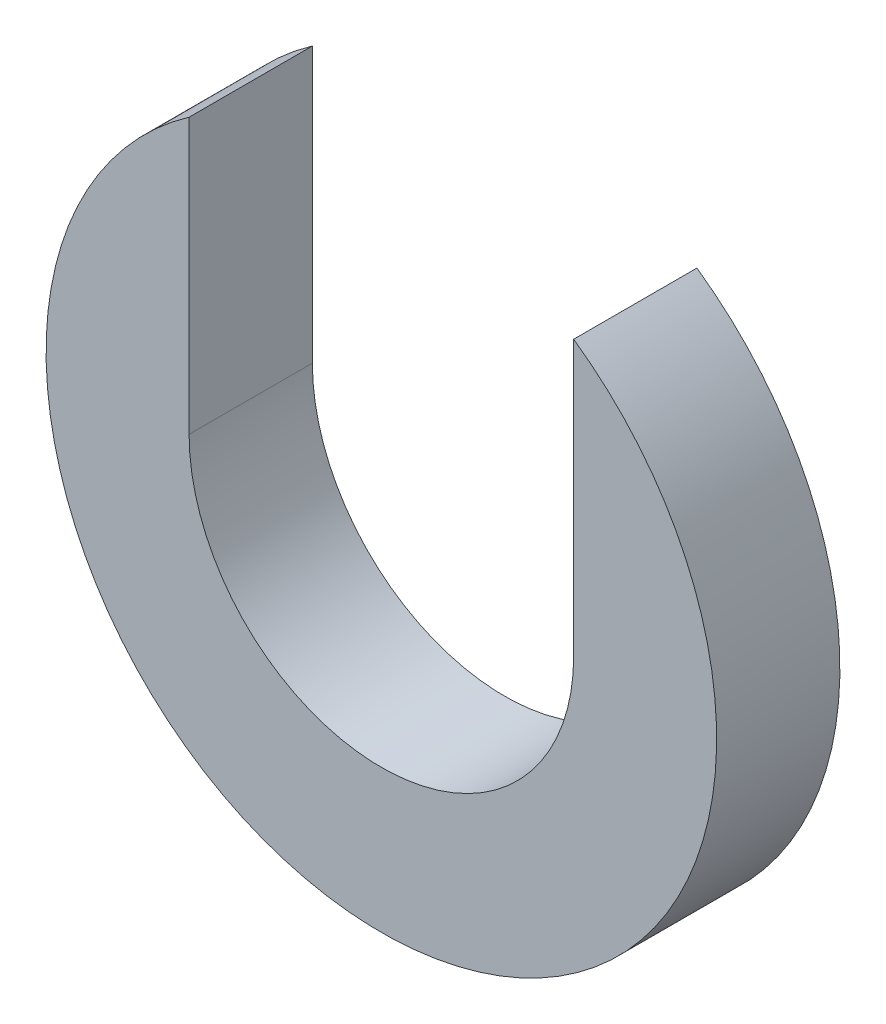
ISO-10303-21;
HEADER;
FILE_DESCRIPTION(('STEP AP214'),'2;1');
FILE_NAME('part.step','',(''),(''),'','','');
FILE_SCHEMA(('AUTOMOTIVE_DESIGN { 1 0 10303 214 1 1 1 1 }'));
ENDSEC;
DATA;
#1=APPLICATION_CONTEXT('core data for automotive mechanical design processes');
#2=APPLICATION_PROTOCOL_DEFINITION('international standard','automotive_design',2000,#1);
#3=PRODUCT_CONTEXT('',#1,'mechanical');
#4=PRODUCT('Part','Part','',(#3));
#5=PRODUCT_RELATED_PRODUCT_CATEGORY('part','',(#4));
#6=PRODUCT_DEFINITION_FORMATION('','',#4);
#7=PRODUCT_DEFINITION_CONTEXT('part definition',#1,'design');
#8=PRODUCT_DEFINITION('design','',#6,#7);
#9=PRODUCT_DEFINITION_SHAPE('','',#8);
#10=(LENGTH_UNIT() NAMED_UNIT(*) SI_UNIT(.MILLI.,.METRE.));
#11=(NAMED_UNIT(*) PLANE_ANGLE_UNIT() SI_UNIT($,.RADIAN.));
#12=(NAMED_UNIT(*) SI_UNIT($,.STERADIAN.) SOLID_ANGLE_UNIT());
#13=UNCERTAINTY_MEASURE_WITH_UNIT(LENGTH_MEASURE(1.E-05),#10,'distance_accuracy_value','');
#14=(GEOMETRIC_REPRESENTATION_CONTEXT(3) GLOBAL_UNCERTAINTY_ASSIGNED_CONTEXT((#13)) GLOBAL_UNIT_ASSIGNED_CONTEXT((#10,
#11,#12)) REPRESENTATION_CONTEXT('',''));
#15=CARTESIAN_POINT('',(0.,0.,0.));
#16=DIRECTION('',(0.,0.,1.));
#17=DIRECTION('',(1.,0.,0.));
#18=AXIS2_PLACEMENT_3D('',#15,#16,#17);
#19=CARTESIAN_POINT('',(0.,0.,3.175));
#20=DIRECTION('',(0.,0.,-1.));
#21=DIRECTION('',(-1.,0.,0.));
#22=AXIS2_PLACEMENT_3D('',#19,#20,#21);
#23=CYLINDRICAL_SURFACE('',#22,4.953);
#24=CARTESIAN_POINT('',(0.,0.,0.));
#25=DIRECTION('',(0.,0.,-1.));
#26=DIRECTION('',(1.,0.,0.));
#27=AXIS2_PLACEMENT_3D('',#24,#25,#26);
#28=CIRCLE('',#27,4.953);
#29=CARTESIAN_POINT('',(4.953,0.,0.));
#30=VERTEX_POINT('',#29);
#31=CARTESIAN_POINT('',(-4.953,0.,0.));
#32=VERTEX_POINT('',#31);
#33=EDGE_CURVE('E102',#30,#32,#28,.T.);
#34=ORIENTED_EDGE('',*,*,#33,.T.);
#35=DIRECTION('',(0.,0.,-1.));
#36=VECTOR('',#35,1.);
#37=CARTESIAN_POINT('',(-4.953,0.,3.175));
#38=LINE('',#37,#36);
#39=CARTESIAN_POINT('',(-4.953,0.,3.175));
#40=VERTEX_POINT('',#39);
#41=EDGE_CURVE('E11',#40,#32,#38,.T.);
#42=ORIENTED_EDGE('',*,*,#41,.F.);
#43=CARTESIAN_POINT('',(0.,0.,3.175));
#44=DIRECTION('',(0.,0.,-1.));
#45=DIRECTION('',(1.,0.,0.));
#46=AXIS2_PLACEMENT_3D('',#43,#44,#45);
#47=CIRCLE('',#46,4.953);
#48=CARTESIAN_POINT('',(4.953,0.,3.175));
#49=VERTEX_POINT('',#48);
#50=EDGE_CURVE('E90',#49,#40,#47,.T.);
#51=ORIENTED_EDGE('',*,*,#50,.F.);
#52=DIRECTION('',(0.,0.,-1.));
#53=VECTOR('',#52,1.);
#54=CARTESIAN_POINT('',(4.953,0.,3.175));
#55=LINE('',#54,#53);
#56=EDGE_CURVE('E98',#49,#30,#55,.T.);
#57=ORIENTED_EDGE('',*,*,#56,.T.);
#58=EDGE_LOOP('',(#34,#42,#51,#57));
#59=FACE_BOUND('',#58,.T.);
#60=ADVANCED_FACE('F39',(#59),#23,.F.);
#61=CARTESIAN_POINT('',(-4.953,0.,3.175));
#62=DIRECTION('',(-1.,0.,0.));
#63=DIRECTION('',(0.,0.,1.));
#64=AXIS2_PLACEMENT_3D('',#61,#62,#63);
#65=PLANE('',#64);
#66=DIRECTION('',(0.,1.,0.));
#67=VECTOR('',#66,1.);
#68=CARTESIAN_POINT('',(-4.953,0.,0.));
#69=LINE('',#68,#67);
#70=CARTESIAN_POINT('',(-4.953,7.07448139442037,0.));
#71=VERTEX_POINT('',#70);
#72=EDGE_CURVE('E94',#32,#71,#69,.T.);
#73=ORIENTED_EDGE('',*,*,#72,.T.);
#74=DIRECTION('',(0.,0.,-1.));
#75=VECTOR('',#74,1.);
#76=CARTESIAN_POINT('',(-4.953,7.07448139442037,3.175));
#77=LINE('',#76,#75);
#78=CARTESIAN_POINT('',(-4.953,7.07448139442037,3.175));
#79=VERTEX_POINT('',#78);
#80=EDGE_CURVE('E47',#79,#71,#77,.T.);
#81=ORIENTED_EDGE('',*,*,#80,.F.);
#82=DIRECTION('',(0.,1.,0.));
#83=VECTOR('',#82,1.);
#84=CARTESIAN_POINT('',(-4.953,0.,3.175));
#85=LINE('',#84,#83);
#86=EDGE_CURVE('E85',#40,#79,#85,.T.);
#87=ORIENTED_EDGE('',*,*,#86,.F.);
#88=ORIENTED_EDGE('',*,*,#41,.T.);
#89=EDGE_LOOP('',(#73,#81,#87,#88));
#90=FACE_BOUND('',#89,.T.);
#91=ADVANCED_FACE('F93',(#90),#65,.F.);
#92=CARTESIAN_POINT('',(0.,0.,3.175));
#93=DIRECTION('',(0.,0.,-1.));
#94=DIRECTION('',(-1.,0.,0.));
#95=AXIS2_PLACEMENT_3D('',#92,#93,#94);
#96=CYLINDRICAL_SURFACE('',#95,8.636);
#97=CARTESIAN_POINT('',(0.,0.,0.));
#98=DIRECTION('',(0.,0.,1.));
#99=DIRECTION('',(1.,0.,0.));
#100=AXIS2_PLACEMENT_3D('',#97,#98,#99);
#101=CIRCLE('',#100,8.636);
#102=CARTESIAN_POINT('',(4.953,7.07448139442037,0.));
#103=VERTEX_POINT('',#102);
#104=EDGE_CURVE('E72',#71,#103,#101,.T.);
#105=ORIENTED_EDGE('',*,*,#104,.T.);
#106=DIRECTION('',(0.,0.,-1.));
#107=VECTOR('',#106,1.);
#108=CARTESIAN_POINT('',(4.953,7.07448139442037,3.175));
#109=LINE('',#108,#107);
#110=CARTESIAN_POINT('',(4.953,7.07448139442037,3.175));
#111=VERTEX_POINT('',#110);
#112=EDGE_CURVE('E95',#111,#103,#109,.T.);
#113=ORIENTED_EDGE('',*,*,#112,.F.);
#114=CARTESIAN_POINT('',(0.,0.,3.175));
#115=DIRECTION('',(0.,0.,1.));
#116=DIRECTION('',(1.,0.,0.));
#117=AXIS2_PLACEMENT_3D('',#114,#115,#116);
#118=CIRCLE('',#117,8.636);
#119=EDGE_CURVE('E88',#79,#111,#118,.T.);
#120=ORIENTED_EDGE('',*,*,#119,.F.);
#121=ORIENTED_EDGE('',*,*,#80,.T.);
#122=EDGE_LOOP('',(#105,#113,#120,#121));
#123=FACE_BOUND('',#122,.T.);
#124=ADVANCED_FACE('F96',(#123),#96,.T.);
#125=CARTESIAN_POINT('',(4.953,0.,3.175));
#126=DIRECTION('',(1.,0.,0.));
#127=DIRECTION('',(0.,0.,-1.));
#128=AXIS2_PLACEMENT_3D('',#125,#126,#127);
#129=PLANE('',#128);
#130=DIRECTION('',(0.,-1.,0.));
#131=VECTOR('',#130,1.);
#132=CARTESIAN_POINT('',(4.953,0.,0.));
#133=LINE('',#132,#131);
#134=EDGE_CURVE('E78',#103,#30,#133,.T.);
#135=ORIENTED_EDGE('',*,*,#134,.T.);
#136=ORIENTED_EDGE('',*,*,#56,.F.);
#137=DIRECTION('',(0.,-1.,0.));
#138=VECTOR('',#137,1.);
#139=CARTESIAN_POINT('',(4.953,0.,3.175));
#140=LINE('',#139,#138);
#141=EDGE_CURVE('E55',#111,#49,#140,.T.);
#142=ORIENTED_EDGE('',*,*,#141,.F.);
#143=ORIENTED_EDGE('',*,*,#112,.T.);
#144=EDGE_LOOP('',(#135,#136,#142,#143));
#145=FACE_BOUND('',#144,.T.);
#146=ADVANCED_FACE('F109',(#145),#129,.F.);
#147=CARTESIAN_POINT('',(0.,0.,3.175));
#148=DIRECTION('',(0.,0.,1.));
#149=DIRECTION('',(1.,0.,0.));
#150=AXIS2_PLACEMENT_3D('',#147,#148,#149);
#151=PLANE('',#150);
#152=ORIENTED_EDGE('',*,*,#50,.T.);
#153=ORIENTED_EDGE('',*,*,#86,.T.);
#154=ORIENTED_EDGE('',*,*,#119,.T.);
#155=ORIENTED_EDGE('',*,*,#141,.T.);
#156=EDGE_LOOP('',(#152,#153,#154,#155));
#157=FACE_BOUND('',#156,.T.);
#158=ADVANCED_FACE('F86',(#157),#151,.T.);
#159=CARTESIAN_POINT('',(0.,0.,0.));
#160=DIRECTION('',(0.,0.,1.));
#161=DIRECTION('',(1.,0.,0.));
#162=AXIS2_PLACEMENT_3D('',#159,#160,#161);
#163=PLANE('',#162);
#164=ORIENTED_EDGE('',*,*,#33,.F.);
#165=ORIENTED_EDGE('',*,*,#134,.F.);
#166=ORIENTED_EDGE('',*,*,#104,.F.);
#167=ORIENTED_EDGE('',*,*,#72,.F.);
#168=EDGE_LOOP('',(#164,#165,#166,#167));
#169=FACE_BOUND('',#168,.T.);
#170=ADVANCED_FACE('F112',(#169),#163,.F.);
#171=CLOSED_SHELL('',(#60,#91,#124,#146,#158,#170));
#172=MANIFOLD_SOLID_BREP('B2',#171);
#173=ADVANCED_BREP_SHAPE_REPRESENTATION('',(#18,#172),#14);
#174=SHAPE_DEFINITION_REPRESENTATION(#9,#173);
ENDSEC;
END-ISO-10303-21;
